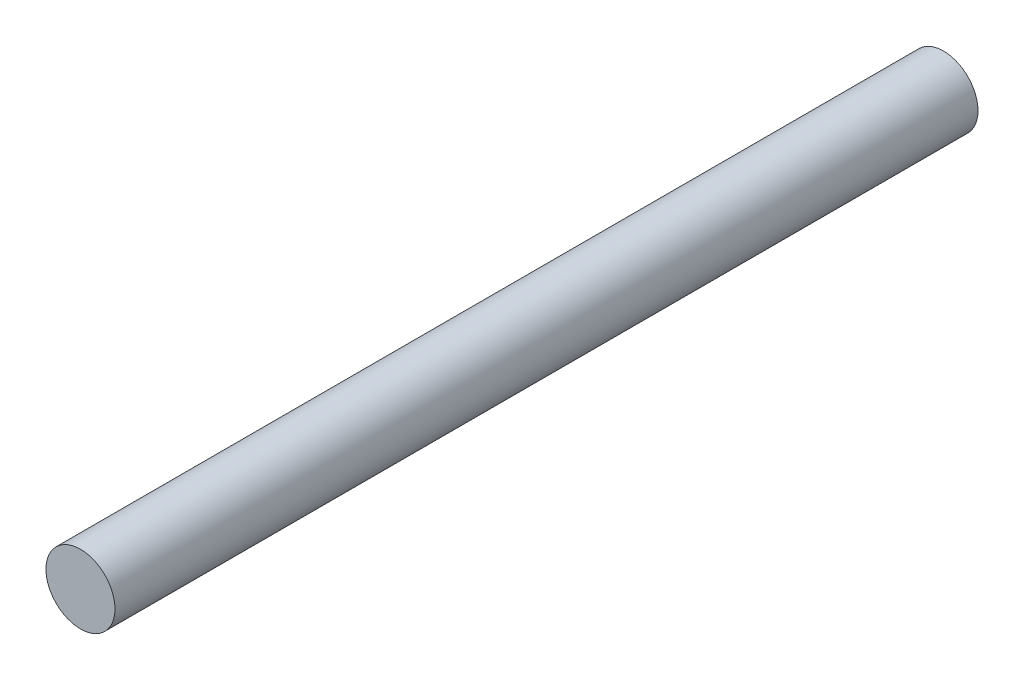
ISO-10303-21;
HEADER;
FILE_DESCRIPTION(('STEP AP214'),'2;1');
FILE_NAME('part.step','',(''),(''),'','','');
FILE_SCHEMA(('AUTOMOTIVE_DESIGN { 1 0 10303 214 1 1 1 1 }'));
ENDSEC;
DATA;
#1=APPLICATION_CONTEXT('core data for automotive mechanical design processes');
#2=APPLICATION_PROTOCOL_DEFINITION('international standard','automotive_design',2000,#1);
#3=PRODUCT_CONTEXT('',#1,'mechanical');
#4=PRODUCT('Part','Part','',(#3));
#5=PRODUCT_RELATED_PRODUCT_CATEGORY('part','',(#4));
#6=PRODUCT_DEFINITION_FORMATION('','',#4);
#7=PRODUCT_DEFINITION_CONTEXT('part definition',#1,'design');
#8=PRODUCT_DEFINITION('design','',#6,#7);
#9=PRODUCT_DEFINITION_SHAPE('','',#8);
#10=(LENGTH_UNIT() NAMED_UNIT(*) SI_UNIT(.MILLI.,.METRE.));
#11=(NAMED_UNIT(*) PLANE_ANGLE_UNIT() SI_UNIT($,.RADIAN.));
#12=(NAMED_UNIT(*) SI_UNIT($,.STERADIAN.) SOLID_ANGLE_UNIT());
#13=UNCERTAINTY_MEASURE_WITH_UNIT(LENGTH_MEASURE(1.E-05),#10,'distance_accuracy_value','');
#14=(GEOMETRIC_REPRESENTATION_CONTEXT(3) GLOBAL_UNCERTAINTY_ASSIGNED_CONTEXT((#13)) GLOBAL_UNIT_ASSIGNED_CONTEXT((#10,
#11,#12)) REPRESENTATION_CONTEXT('',''));
#15=CARTESIAN_POINT('',(0.,0.,0.));
#16=DIRECTION('',(0.,0.,1.));
#17=DIRECTION('',(1.,0.,0.));
#18=AXIS2_PLACEMENT_3D('',#15,#16,#17);
#19=CARTESIAN_POINT('',(0.,0.,100.));
#20=DIRECTION('',(0.,0.,-1.));
#21=DIRECTION('',(-1.,0.,0.));
#22=AXIS2_PLACEMENT_3D('',#19,#20,#21);
#23=CYLINDRICAL_SURFACE('',#22,4.);
#24=CARTESIAN_POINT('',(0.,0.,100.));
#25=DIRECTION('',(0.,0.,1.));
#26=DIRECTION('',(1.,0.,0.));
#27=AXIS2_PLACEMENT_3D('',#24,#25,#26);
#28=CIRCLE('',#27,4.);
#29=CARTESIAN_POINT('',(4.,0.,100.));
#30=VERTEX_POINT('',#29);
#31=EDGE_CURVE('E10',#30,#30,#28,.T.);
#32=ORIENTED_EDGE('',*,*,#31,.F.);
#33=EDGE_LOOP('',(#32));
#34=FACE_BOUND('',#33,.T.);
#35=CARTESIAN_POINT('',(0.,0.,0.));
#36=DIRECTION('',(0.,0.,1.));
#37=DIRECTION('',(1.,0.,0.));
#38=AXIS2_PLACEMENT_3D('',#35,#36,#37);
#39=CIRCLE('',#38,4.);
#40=CARTESIAN_POINT('',(4.,0.,0.));
#41=VERTEX_POINT('',#40);
#42=EDGE_CURVE('E36',#41,#41,#39,.T.);
#43=ORIENTED_EDGE('',*,*,#42,.T.);
#44=EDGE_LOOP('',(#43));
#45=FACE_BOUND('',#44,.T.);
#46=ADVANCED_FACE('F33',(#34,#45),#23,.T.);
#47=CARTESIAN_POINT('',(0.,0.,100.));
#48=DIRECTION('',(0.,0.,1.));
#49=DIRECTION('',(1.,0.,0.));
#50=AXIS2_PLACEMENT_3D('',#47,#48,#49);
#51=PLANE('',#50);
#52=ORIENTED_EDGE('',*,*,#31,.T.);
#53=EDGE_LOOP('',(#52));
#54=FACE_BOUND('',#53,.T.);
#55=ADVANCED_FACE('F48',(#54),#51,.T.);
#56=CARTESIAN_POINT('',(0.,0.,0.));
#57=DIRECTION('',(0.,0.,1.));
#58=DIRECTION('',(1.,0.,0.));
#59=AXIS2_PLACEMENT_3D('',#56,#57,#58);
#60=PLANE('',#59);
#61=ORIENTED_EDGE('',*,*,#42,.F.);
#62=EDGE_LOOP('',(#61));
#63=FACE_BOUND('',#62,.T.);
#64=ADVANCED_FACE('F46',(#63),#60,.F.);
#65=CLOSED_SHELL('',(#46,#55,#64));
#66=MANIFOLD_SOLID_BREP('B2',#65);
#67=ADVANCED_BREP_SHAPE_REPRESENTATION('',(#18,#66),#14);
#68=SHAPE_DEFINITION_REPRESENTATION(#9,#67);
ENDSEC;
END-ISO-10303-21;
